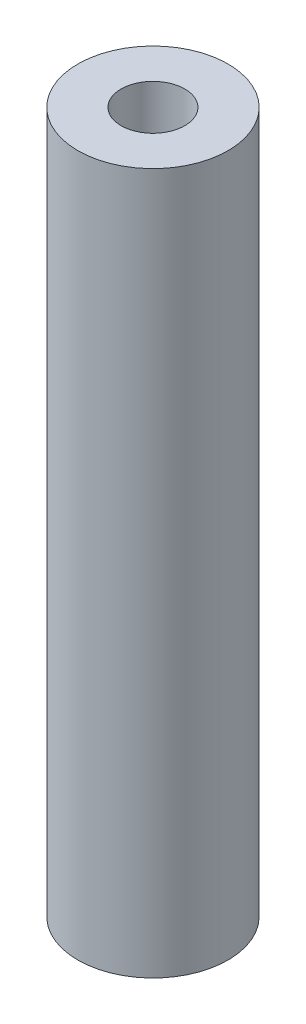
ISO-10303-21;
HEADER;
FILE_DESCRIPTION(('STEP AP214'),'2;1');
FILE_NAME('part.step','',(''),(''),'','','');
FILE_SCHEMA(('AUTOMOTIVE_DESIGN { 1 0 10303 214 1 1 1 1 }'));
ENDSEC;
DATA;
#1=APPLICATION_CONTEXT('core data for automotive mechanical design processes');
#2=APPLICATION_PROTOCOL_DEFINITION('international standard','automotive_design',2000,#1);
#3=PRODUCT_CONTEXT('',#1,'mechanical');
#4=PRODUCT('Part','Part','',(#3));
#5=PRODUCT_RELATED_PRODUCT_CATEGORY('part','',(#4));
#6=PRODUCT_DEFINITION_FORMATION('','',#4);
#7=PRODUCT_DEFINITION_CONTEXT('part definition',#1,'design');
#8=PRODUCT_DEFINITION('design','',#6,#7);
#9=PRODUCT_DEFINITION_SHAPE('','',#8);
#10=(LENGTH_UNIT() NAMED_UNIT(*) SI_UNIT(.MILLI.,.METRE.));
#11=(NAMED_UNIT(*) PLANE_ANGLE_UNIT() SI_UNIT($,.RADIAN.));
#12=(NAMED_UNIT(*) SI_UNIT($,.STERADIAN.) SOLID_ANGLE_UNIT());
#13=UNCERTAINTY_MEASURE_WITH_UNIT(LENGTH_MEASURE(1.E-05),#10,'distance_accuracy_value','');
#14=(GEOMETRIC_REPRESENTATION_CONTEXT(3) GLOBAL_UNCERTAINTY_ASSIGNED_CONTEXT((#13)) GLOBAL_UNIT_ASSIGNED_CONTEXT((#10,
#11,#12)) REPRESENTATION_CONTEXT('',''));
#15=CARTESIAN_POINT('',(0.,0.,0.));
#16=DIRECTION('',(0.,0.,1.));
#17=DIRECTION('',(1.,0.,0.));
#18=AXIS2_PLACEMENT_3D('',#15,#16,#17);
#19=CARTESIAN_POINT('',(0.,44.45,0.));
#20=DIRECTION('',(0.,1.,0.));
#21=DIRECTION('',(0.,0.,1.));
#22=AXIS2_PLACEMENT_3D('',#19,#20,#21);
#23=PLANE('',#22);
#24=CARTESIAN_POINT('',(0.,44.45,0.));
#25=DIRECTION('',(0.,1.,0.));
#26=DIRECTION('',(0.,0.,1.));
#27=AXIS2_PLACEMENT_3D('',#24,#25,#26);
#28=CIRCLE('',#27,4.7625);
#29=CARTESIAN_POINT('',(0.,44.45,4.7625));
#30=VERTEX_POINT('',#29);
#31=EDGE_CURVE('E10',#30,#30,#28,.T.);
#32=ORIENTED_EDGE('',*,*,#31,.T.);
#33=EDGE_LOOP('',(#32));
#34=FACE_BOUND('',#33,.T.);
#35=CARTESIAN_POINT('',(0.,44.45,0.));
#36=DIRECTION('',(0.,1.,0.));
#37=DIRECTION('',(0.,0.,1.));
#38=AXIS2_PLACEMENT_3D('',#35,#36,#37);
#39=CIRCLE('',#38,2.0193);
#40=CARTESIAN_POINT('',(0.,44.45,2.0193));
#41=VERTEX_POINT('',#40);
#42=EDGE_CURVE('E42',#41,#41,#39,.T.);
#43=ORIENTED_EDGE('',*,*,#42,.F.);
#44=EDGE_LOOP('',(#43));
#45=FACE_BOUND('',#44,.T.);
#46=ADVANCED_FACE('F31',(#34,#45),#23,.T.);
#47=CARTESIAN_POINT('',(0.,0.,0.));
#48=DIRECTION('',(0.,1.,0.));
#49=DIRECTION('',(0.,0.,1.));
#50=AXIS2_PLACEMENT_3D('',#47,#48,#49);
#51=PLANE('',#50);
#52=CARTESIAN_POINT('',(0.,0.,0.));
#53=DIRECTION('',(0.,1.,0.));
#54=DIRECTION('',(0.,0.,1.));
#55=AXIS2_PLACEMENT_3D('',#52,#53,#54);
#56=CIRCLE('',#55,4.7625);
#57=CARTESIAN_POINT('',(0.,0.,4.7625));
#58=VERTEX_POINT('',#57);
#59=EDGE_CURVE('E35',#58,#58,#56,.T.);
#60=ORIENTED_EDGE('',*,*,#59,.F.);
#61=EDGE_LOOP('',(#60));
#62=FACE_BOUND('',#61,.T.);
#63=CARTESIAN_POINT('',(0.,0.,0.));
#64=DIRECTION('',(0.,1.,0.));
#65=DIRECTION('',(0.,0.,1.));
#66=AXIS2_PLACEMENT_3D('',#63,#64,#65);
#67=CIRCLE('',#66,2.0193);
#68=CARTESIAN_POINT('',(0.,0.,2.0193));
#69=VERTEX_POINT('',#68);
#70=EDGE_CURVE('E44',#69,#69,#67,.T.);
#71=ORIENTED_EDGE('',*,*,#70,.T.);
#72=EDGE_LOOP('',(#71));
#73=FACE_BOUND('',#72,.T.);
#74=ADVANCED_FACE('F54',(#62,#73),#51,.F.);
#75=CARTESIAN_POINT('',(0.,44.45,0.));
#76=DIRECTION('',(0.,-1.,0.));
#77=DIRECTION('',(0.,0.,-1.));
#78=AXIS2_PLACEMENT_3D('',#75,#76,#77);
#79=CYLINDRICAL_SURFACE('',#78,4.7625);
#80=ORIENTED_EDGE('',*,*,#31,.F.);
#81=EDGE_LOOP('',(#80));
#82=FACE_BOUND('',#81,.T.);
#83=ORIENTED_EDGE('',*,*,#59,.T.);
#84=EDGE_LOOP('',(#83));
#85=FACE_BOUND('',#84,.T.);
#86=ADVANCED_FACE('F33',(#82,#85),#79,.T.);
#87=CARTESIAN_POINT('',(0.,44.45,0.));
#88=DIRECTION('',(0.,-1.,0.));
#89=DIRECTION('',(0.,0.,-1.));
#90=AXIS2_PLACEMENT_3D('',#87,#88,#89);
#91=CYLINDRICAL_SURFACE('',#90,2.0193);
#92=ORIENTED_EDGE('',*,*,#42,.T.);
#93=EDGE_LOOP('',(#92));
#94=FACE_BOUND('',#93,.T.);
#95=ORIENTED_EDGE('',*,*,#70,.F.);
#96=EDGE_LOOP('',(#95));
#97=FACE_BOUND('',#96,.T.);
#98=ADVANCED_FACE('F50',(#94,#97),#91,.F.);
#99=CLOSED_SHELL('',(#46,#74,#86,#98));
#100=MANIFOLD_SOLID_BREP('B2',#99);
#101=ADVANCED_BREP_SHAPE_REPRESENTATION('',(#18,#100),#14);
#102=SHAPE_DEFINITION_REPRESENTATION(#9,#101);
ENDSEC;
END-ISO-10303-21;
